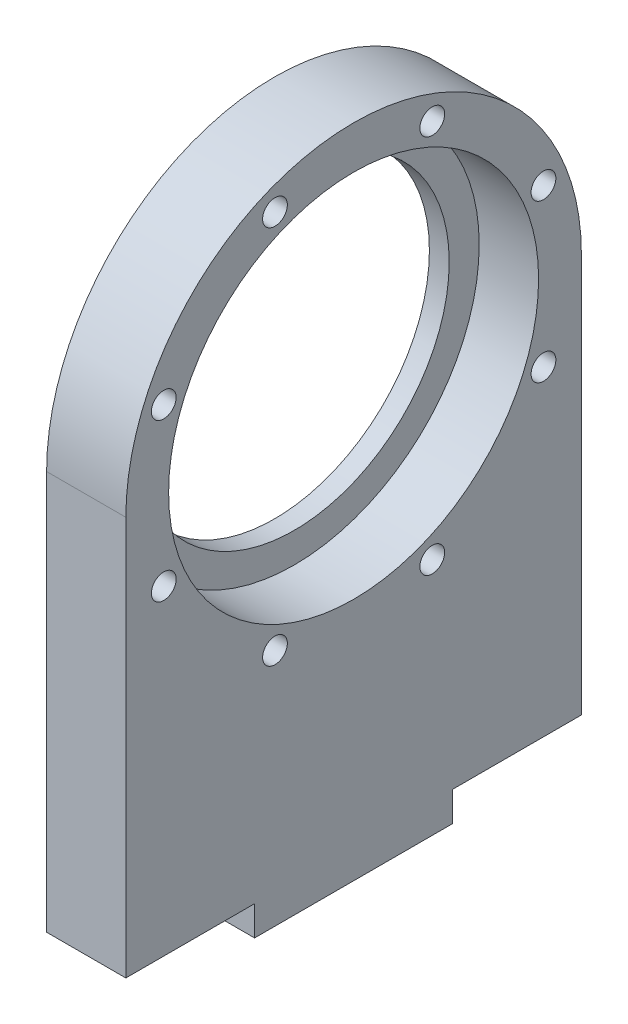
ISO-10303-21;
HEADER;
FILE_DESCRIPTION(('STEP AP214'),'2;1');
FILE_NAME('part.step','',(''),(''),'','','');
FILE_SCHEMA(('AUTOMOTIVE_DESIGN { 1 0 10303 214 1 1 1 1 }'));
ENDSEC;
DATA;
#1=APPLICATION_CONTEXT('core data for automotive mechanical design processes');
#2=APPLICATION_PROTOCOL_DEFINITION('international standard','automotive_design',2000,#1);
#3=PRODUCT_CONTEXT('',#1,'mechanical');
#4=PRODUCT('Part','Part','',(#3));
#5=PRODUCT_RELATED_PRODUCT_CATEGORY('part','',(#4));
#6=PRODUCT_DEFINITION_FORMATION('','',#4);
#7=PRODUCT_DEFINITION_CONTEXT('part definition',#1,'design');
#8=PRODUCT_DEFINITION('design','',#6,#7);
#9=PRODUCT_DEFINITION_SHAPE('','',#8);
#10=(LENGTH_UNIT() NAMED_UNIT(*) SI_UNIT(.MILLI.,.METRE.));
#11=(NAMED_UNIT(*) PLANE_ANGLE_UNIT() SI_UNIT($,.RADIAN.));
#12=(NAMED_UNIT(*) SI_UNIT($,.STERADIAN.) SOLID_ANGLE_UNIT());
#13=UNCERTAINTY_MEASURE_WITH_UNIT(LENGTH_MEASURE(1.E-05),#10,'distance_accuracy_value','');
#14=(GEOMETRIC_REPRESENTATION_CONTEXT(3) GLOBAL_UNCERTAINTY_ASSIGNED_CONTEXT((#13)) GLOBAL_UNIT_ASSIGNED_CONTEXT((#10,
#11,#12)) REPRESENTATION_CONTEXT('',''));
#15=CARTESIAN_POINT('',(0.,0.,0.));
#16=DIRECTION('',(0.,0.,1.));
#17=DIRECTION('',(1.,0.,0.));
#18=AXIS2_PLACEMENT_3D('',#15,#16,#17);
#19=CARTESIAN_POINT('',(8.,-40.29,-23.));
#20=DIRECTION('',(0.,-1.,0.));
#21=DIRECTION('',(0.,0.,-1.));
#22=AXIS2_PLACEMENT_3D('',#19,#20,#21);
#23=PLANE('',#22);
#24=DIRECTION('',(1.,0.,0.));
#25=VECTOR('',#24,1.);
#26=CARTESIAN_POINT('',(0.,-40.29,-9.99999999999999));
#27=LINE('',#26,#25);
#28=CARTESIAN_POINT('',(0.,-40.29,-9.99999999999999));
#29=VERTEX_POINT('',#28);
#30=CARTESIAN_POINT('',(8.,-40.29,-9.99999999999999));
#31=VERTEX_POINT('',#30);
#32=EDGE_CURVE('E130',#29,#31,#27,.T.);
#33=ORIENTED_EDGE('',*,*,#32,.F.);
#34=DIRECTION('',(0.,0.,1.));
#35=VECTOR('',#34,1.);
#36=CARTESIAN_POINT('',(0.,-40.29,-23.));
#37=LINE('',#36,#35);
#38=CARTESIAN_POINT('',(0.,-40.29,-23.));
#39=VERTEX_POINT('',#38);
#40=EDGE_CURVE('E165',#39,#29,#37,.T.);
#41=ORIENTED_EDGE('',*,*,#40,.F.);
#42=DIRECTION('',(-1.,0.,0.));
#43=VECTOR('',#42,1.);
#44=CARTESIAN_POINT('',(8.,-40.29,-23.));
#45=LINE('',#44,#43);
#46=CARTESIAN_POINT('',(8.,-40.29,-23.));
#47=VERTEX_POINT('',#46);
#48=EDGE_CURVE('E176',#47,#39,#45,.T.);
#49=ORIENTED_EDGE('',*,*,#48,.F.);
#50=DIRECTION('',(0.,0.,1.));
#51=VECTOR('',#50,1.);
#52=CARTESIAN_POINT('',(8.,-40.29,-23.));
#53=LINE('',#52,#51);
#54=EDGE_CURVE('E69',#47,#31,#53,.T.);
#55=ORIENTED_EDGE('',*,*,#54,.T.);
#56=EDGE_LOOP('',(#33,#41,#49,#55));
#57=FACE_BOUND('',#56,.T.);
#58=CARTESIAN_POINT('',(4.,-40.29,-19.));
#59=DIRECTION('',(0.,1.,0.));
#60=DIRECTION('',(0.,0.,1.));
#61=AXIS2_PLACEMENT_3D('',#58,#59,#60);
#62=CIRCLE('',#61,1.8);
#63=CARTESIAN_POINT('',(4.,-40.29,-17.2));
#64=VERTEX_POINT('',#63);
#65=EDGE_CURVE('E136',#64,#64,#62,.T.);
#66=ORIENTED_EDGE('',*,*,#65,.T.);
#67=EDGE_LOOP('',(#66));
#68=FACE_BOUND('',#67,.T.);
#69=ADVANCED_FACE('F46',(#57,#68),#23,.T.);
#70=CARTESIAN_POINT('',(8.,0.,0.));
#71=DIRECTION('',(-1.,0.,0.));
#72=DIRECTION('',(0.,0.,1.));
#73=AXIS2_PLACEMENT_3D('',#70,#71,#72);
#74=CYLINDRICAL_SURFACE('',#73,23.);
#75=DIRECTION('',(-1.,0.,0.));
#76=VECTOR('',#75,1.);
#77=CARTESIAN_POINT('',(8.,0.,23.));
#78=LINE('',#77,#76);
#79=CARTESIAN_POINT('',(8.,0.,23.));
#80=VERTEX_POINT('',#79);
#81=CARTESIAN_POINT('',(0.,0.,23.));
#82=VERTEX_POINT('',#81);
#83=EDGE_CURVE('E170',#80,#82,#78,.T.);
#84=ORIENTED_EDGE('',*,*,#83,.F.);
#85=CARTESIAN_POINT('',(8.,0.,0.));
#86=DIRECTION('',(1.,0.,0.));
#87=DIRECTION('',(0.,0.,-1.));
#88=AXIS2_PLACEMENT_3D('',#85,#86,#87);
#89=CIRCLE('',#88,23.);
#90=CARTESIAN_POINT('',(8.,0.,-23.));
#91=VERTEX_POINT('',#90);
#92=EDGE_CURVE('E208',#91,#80,#89,.T.);
#93=ORIENTED_EDGE('',*,*,#92,.F.);
#94=DIRECTION('',(-1.,0.,0.));
#95=VECTOR('',#94,1.);
#96=CARTESIAN_POINT('',(8.,0.,-23.));
#97=LINE('',#96,#95);
#98=CARTESIAN_POINT('',(0.,0.,-23.));
#99=VERTEX_POINT('',#98);
#100=EDGE_CURVE('E161',#91,#99,#97,.T.);
#101=ORIENTED_EDGE('',*,*,#100,.T.);
#102=CARTESIAN_POINT('',(0.,0.,0.));
#103=DIRECTION('',(1.,0.,0.));
#104=DIRECTION('',(0.,0.,-1.));
#105=AXIS2_PLACEMENT_3D('',#102,#103,#104);
#106=CIRCLE('',#105,23.);
#107=EDGE_CURVE('E184',#99,#82,#106,.T.);
#108=ORIENTED_EDGE('',*,*,#107,.T.);
#109=EDGE_LOOP('',(#84,#93,#101,#108));
#110=FACE_BOUND('',#109,.T.);
#111=ADVANCED_FACE('F247',(#110),#74,.T.);
#112=CARTESIAN_POINT('',(2.,0.,0.));
#113=DIRECTION('',(-1.,0.,0.));
#114=DIRECTION('',(0.,0.,1.));
#115=AXIS2_PLACEMENT_3D('',#112,#113,#114);
#116=CYLINDRICAL_SURFACE('',#115,15.6521739130435);
#117=CARTESIAN_POINT('',(2.,0.,0.));
#118=DIRECTION('',(1.,0.,0.));
#119=DIRECTION('',(0.,0.,-1.));
#120=AXIS2_PLACEMENT_3D('',#117,#118,#119);
#121=CIRCLE('',#120,15.6521739130435);
#122=CARTESIAN_POINT('',(2.,0.,-15.6521739130435));
#123=VERTEX_POINT('',#122);
#124=EDGE_CURVE('E11',#123,#123,#121,.T.);
#125=ORIENTED_EDGE('',*,*,#124,.T.);
#126=EDGE_LOOP('',(#125));
#127=FACE_BOUND('',#126,.T.);
#128=CARTESIAN_POINT('',(0.,0.,0.));
#129=DIRECTION('',(1.,0.,0.));
#130=DIRECTION('',(0.,0.,-1.));
#131=AXIS2_PLACEMENT_3D('',#128,#129,#130);
#132=CIRCLE('',#131,15.6521739130435);
#133=CARTESIAN_POINT('',(0.,0.,-15.6521739130435));
#134=VERTEX_POINT('',#133);
#135=EDGE_CURVE('E50',#134,#134,#132,.T.);
#136=ORIENTED_EDGE('',*,*,#135,.F.);
#137=EDGE_LOOP('',(#136));
#138=FACE_BOUND('',#137,.T.);
#139=ADVANCED_FACE('F48',(#127,#138),#116,.F.);
#140=CARTESIAN_POINT('',(2.,0.,0.));
#141=DIRECTION('',(1.,0.,0.));
#142=DIRECTION('',(0.,0.,-1.));
#143=AXIS2_PLACEMENT_3D('',#140,#141,#142);
#144=PLANE('',#143);
#145=ORIENTED_EDGE('',*,*,#124,.F.);
#146=EDGE_LOOP('',(#145));
#147=FACE_BOUND('',#146,.T.);
#148=CARTESIAN_POINT('',(2.,0.,0.));
#149=DIRECTION('',(1.,0.,0.));
#150=DIRECTION('',(0.,0.,-1.));
#151=AXIS2_PLACEMENT_3D('',#148,#149,#150);
#152=CIRCLE('',#151,18.68);
#153=CARTESIAN_POINT('',(2.,0.,-18.68));
#154=VERTEX_POINT('',#153);
#155=EDGE_CURVE('E210',#154,#154,#152,.F.);
#156=ORIENTED_EDGE('',*,*,#155,.F.);
#157=EDGE_LOOP('',(#156));
#158=FACE_BOUND('',#157,.T.);
#159=ADVANCED_FACE('F246',(#147,#158),#144,.T.);
#160=CARTESIAN_POINT('',(0.,0.,0.));
#161=DIRECTION('',(1.,0.,0.));
#162=DIRECTION('',(0.,0.,-1.));
#163=AXIS2_PLACEMENT_3D('',#160,#161,#162);
#164=PLANE('',#163);
#165=ORIENTED_EDGE('',*,*,#135,.T.);
#166=EDGE_LOOP('',(#165));
#167=FACE_BOUND('',#166,.T.);
#168=CARTESIAN_POINT('',(0.,19.1705002996092,7.9406812215757));
#169=DIRECTION('',(1.,0.,0.));
#170=DIRECTION('',(0.,0.,-1.));
#171=AXIS2_PLACEMENT_3D('',#168,#169,#170);
#172=CIRCLE('',#171,1.25);
#173=CARTESIAN_POINT('',(0.,19.1705002996092,6.6906812215757));
#174=VERTEX_POINT('',#173);
#175=EDGE_CURVE('E172',#174,#174,#172,.T.);
#176=ORIENTED_EDGE('',*,*,#175,.T.);
#177=EDGE_LOOP('',(#176));
#178=FACE_BOUND('',#177,.T.);
#179=CARTESIAN_POINT('',(0.,7.94068122157552,19.1705002996092));
#180=DIRECTION('',(1.,0.,0.));
#181=DIRECTION('',(0.,0.,-1.));
#182=AXIS2_PLACEMENT_3D('',#179,#180,#181);
#183=CIRCLE('',#182,1.25);
#184=CARTESIAN_POINT('',(0.,7.94068122157552,17.9205002996092));
#185=VERTEX_POINT('',#184);
#186=EDGE_CURVE('E213',#185,#185,#183,.T.);
#187=ORIENTED_EDGE('',*,*,#186,.T.);
#188=EDGE_LOOP('',(#187));
#189=FACE_BOUND('',#188,.T.);
#190=CARTESIAN_POINT('',(0.,-7.94068122157571,19.1705002996092));
#191=DIRECTION('',(1.,0.,0.));
#192=DIRECTION('',(0.,0.,-1.));
#193=AXIS2_PLACEMENT_3D('',#190,#191,#192);
#194=CIRCLE('',#193,1.25);
#195=CARTESIAN_POINT('',(0.,-7.94068122157571,17.9205002996092));
#196=VERTEX_POINT('',#195);
#197=EDGE_CURVE('E216',#196,#196,#194,.T.);
#198=ORIENTED_EDGE('',*,*,#197,.T.);
#199=EDGE_LOOP('',(#198));
#200=FACE_BOUND('',#199,.T.);
#201=CARTESIAN_POINT('',(0.,-19.1705002996092,7.94068122157552));
#202=DIRECTION('',(1.,0.,0.));
#203=DIRECTION('',(0.,0.,-1.));
#204=AXIS2_PLACEMENT_3D('',#201,#202,#203);
#205=CIRCLE('',#204,1.25);
#206=CARTESIAN_POINT('',(0.,-19.1705002996092,6.69068122157552));
#207=VERTEX_POINT('',#206);
#208=EDGE_CURVE('E219',#207,#207,#205,.T.);
#209=ORIENTED_EDGE('',*,*,#208,.T.);
#210=EDGE_LOOP('',(#209));
#211=FACE_BOUND('',#210,.T.);
#212=CARTESIAN_POINT('',(0.,-19.1705002996092,-7.94068122157571));
#213=DIRECTION('',(1.,0.,0.));
#214=DIRECTION('',(0.,0.,-1.));
#215=AXIS2_PLACEMENT_3D('',#212,#213,#214);
#216=CIRCLE('',#215,1.25);
#217=CARTESIAN_POINT('',(0.,-19.1705002996092,-9.1906812215757));
#218=VERTEX_POINT('',#217);
#219=EDGE_CURVE('E222',#218,#218,#216,.T.);
#220=ORIENTED_EDGE('',*,*,#219,.T.);
#221=EDGE_LOOP('',(#220));
#222=FACE_BOUND('',#221,.T.);
#223=CARTESIAN_POINT('',(0.,-7.94068122157552,-19.1705002996092));
#224=DIRECTION('',(1.,0.,0.));
#225=DIRECTION('',(0.,0.,-1.));
#226=AXIS2_PLACEMENT_3D('',#223,#224,#225);
#227=CIRCLE('',#226,1.25);
#228=CARTESIAN_POINT('',(0.,-7.94068122157552,-20.4205002996092));
#229=VERTEX_POINT('',#228);
#230=EDGE_CURVE('E225',#229,#229,#227,.T.);
#231=ORIENTED_EDGE('',*,*,#230,.T.);
#232=EDGE_LOOP('',(#231));
#233=FACE_BOUND('',#232,.T.);
#234=CARTESIAN_POINT('',(0.,7.94068122157571,-19.1705002996092));
#235=DIRECTION('',(1.,0.,0.));
#236=DIRECTION('',(0.,0.,-1.));
#237=AXIS2_PLACEMENT_3D('',#234,#235,#236);
#238=CIRCLE('',#237,1.25);
#239=CARTESIAN_POINT('',(0.,7.94068122157571,-20.4205002996092));
#240=VERTEX_POINT('',#239);
#241=EDGE_CURVE('E228',#240,#240,#238,.T.);
#242=ORIENTED_EDGE('',*,*,#241,.T.);
#243=EDGE_LOOP('',(#242));
#244=FACE_BOUND('',#243,.T.);
#245=CARTESIAN_POINT('',(0.,19.1705002996092,-7.94068122157552));
#246=DIRECTION('',(1.,0.,0.));
#247=DIRECTION('',(0.,0.,-1.));
#248=AXIS2_PLACEMENT_3D('',#245,#246,#247);
#249=CIRCLE('',#248,1.25);
#250=CARTESIAN_POINT('',(0.,19.1705002996092,-9.19068122157552));
#251=VERTEX_POINT('',#250);
#252=EDGE_CURVE('E231',#251,#251,#249,.T.);
#253=ORIENTED_EDGE('',*,*,#252,.T.);
#254=EDGE_LOOP('',(#253));
#255=FACE_BOUND('',#254,.T.);
#256=ORIENTED_EDGE('',*,*,#107,.F.);
#257=DIRECTION('',(0.,-1.,0.));
#258=VECTOR('',#257,1.);
#259=CARTESIAN_POINT('',(0.,-40.29,-23.));
#260=LINE('',#259,#258);
#261=EDGE_CURVE('E151',#99,#39,#260,.T.);
#262=ORIENTED_EDGE('',*,*,#261,.T.);
#263=ORIENTED_EDGE('',*,*,#40,.T.);
#264=DIRECTION('',(0.,1.,0.));
#265=VECTOR('',#264,1.);
#266=CARTESIAN_POINT('',(0.,-43.29,-9.99999999999999));
#267=LINE('',#266,#265);
#268=CARTESIAN_POINT('',(0.,-43.29,-9.99999999999999));
#269=VERTEX_POINT('',#268);
#270=EDGE_CURVE('E141',#269,#29,#267,.T.);
#271=ORIENTED_EDGE('',*,*,#270,.F.);
#272=DIRECTION('',(0.,0.,-1.));
#273=VECTOR('',#272,1.);
#274=CARTESIAN_POINT('',(0.,-43.29,10.));
#275=LINE('',#274,#273);
#276=CARTESIAN_POINT('',(0.,-43.29,10.));
#277=VERTEX_POINT('',#276);
#278=EDGE_CURVE('E120',#277,#269,#275,.T.);
#279=ORIENTED_EDGE('',*,*,#278,.F.);
#280=DIRECTION('',(0.,1.,0.));
#281=VECTOR('',#280,1.);
#282=CARTESIAN_POINT('',(0.,-43.29,10.));
#283=LINE('',#282,#281);
#284=CARTESIAN_POINT('',(0.,-40.29,10.));
#285=VERTEX_POINT('',#284);
#286=EDGE_CURVE('E117',#277,#285,#283,.T.);
#287=ORIENTED_EDGE('',*,*,#286,.T.);
#288=CARTESIAN_POINT('',(0.,-40.29,23.));
#289=VERTEX_POINT('',#288);
#290=EDGE_CURVE('E164',#285,#289,#37,.T.);
#291=ORIENTED_EDGE('',*,*,#290,.T.);
#292=DIRECTION('',(0.,1.,0.));
#293=VECTOR('',#292,1.);
#294=CARTESIAN_POINT('',(0.,-40.29,23.));
#295=LINE('',#294,#293);
#296=EDGE_CURVE('E157',#289,#82,#295,.T.);
#297=ORIENTED_EDGE('',*,*,#296,.T.);
#298=EDGE_LOOP('',(#256,#262,#263,#271,#279,#287,#291,#297));
#299=FACE_BOUND('',#298,.T.);
#300=ADVANCED_FACE('F242',(#167,#178,#189,#200,#211,#222,#233,#244,#255,#299),#164,.F.);
#301=CARTESIAN_POINT('',(8.,0.,0.));
#302=DIRECTION('',(-1.,0.,0.));
#303=DIRECTION('',(0.,0.,1.));
#304=AXIS2_PLACEMENT_3D('',#301,#302,#303);
#305=CYLINDRICAL_SURFACE('',#304,18.68);
#306=ORIENTED_EDGE('',*,*,#155,.T.);
#307=EDGE_LOOP('',(#306));
#308=FACE_BOUND('',#307,.T.);
#309=CARTESIAN_POINT('',(8.,0.,0.));
#310=DIRECTION('',(1.,0.,0.));
#311=DIRECTION('',(0.,0.,-1.));
#312=AXIS2_PLACEMENT_3D('',#309,#310,#311);
#313=CIRCLE('',#312,18.68);
#314=CARTESIAN_POINT('',(8.,0.,-18.68));
#315=VERTEX_POINT('',#314);
#316=EDGE_CURVE('E205',#315,#315,#313,.T.);
#317=ORIENTED_EDGE('',*,*,#316,.T.);
#318=EDGE_LOOP('',(#317));
#319=FACE_BOUND('',#318,.T.);
#320=ADVANCED_FACE('F444',(#308,#319),#305,.F.);
#321=CARTESIAN_POINT('',(8.,19.1705002996092,-7.94068122157552));
#322=DIRECTION('',(-1.,0.,0.));
#323=DIRECTION('',(0.,0.,1.));
#324=AXIS2_PLACEMENT_3D('',#321,#322,#323);
#325=CYLINDRICAL_SURFACE('',#324,1.25);
#326=CARTESIAN_POINT('',(8.,19.1705002996092,-7.94068122157552));
#327=DIRECTION('',(1.,0.,0.));
#328=DIRECTION('',(0.,0.,-1.));
#329=AXIS2_PLACEMENT_3D('',#326,#327,#328);
#330=CIRCLE('',#329,1.25);
#331=CARTESIAN_POINT('',(8.,19.1705002996092,-9.19068122157552));
#332=VERTEX_POINT('',#331);
#333=EDGE_CURVE('E202',#332,#332,#330,.T.);
#334=ORIENTED_EDGE('',*,*,#333,.T.);
#335=EDGE_LOOP('',(#334));
#336=FACE_BOUND('',#335,.T.);
#337=ORIENTED_EDGE('',*,*,#252,.F.);
#338=EDGE_LOOP('',(#337));
#339=FACE_BOUND('',#338,.T.);
#340=ADVANCED_FACE('F433',(#336,#339),#325,.F.);
#341=CARTESIAN_POINT('',(8.,7.94068122157571,-19.1705002996092));
#342=DIRECTION('',(-1.,0.,0.));
#343=DIRECTION('',(0.,0.,1.));
#344=AXIS2_PLACEMENT_3D('',#341,#342,#343);
#345=CYLINDRICAL_SURFACE('',#344,1.25);
#346=CARTESIAN_POINT('',(8.,7.94068122157571,-19.1705002996092));
#347=DIRECTION('',(1.,0.,0.));
#348=DIRECTION('',(0.,0.,-1.));
#349=AXIS2_PLACEMENT_3D('',#346,#347,#348);
#350=CIRCLE('',#349,1.25);
#351=CARTESIAN_POINT('',(8.,7.94068122157571,-20.4205002996092));
#352=VERTEX_POINT('',#351);
#353=EDGE_CURVE('E199',#352,#352,#350,.T.);
#354=ORIENTED_EDGE('',*,*,#353,.T.);
#355=EDGE_LOOP('',(#354));
#356=FACE_BOUND('',#355,.T.);
#357=ORIENTED_EDGE('',*,*,#241,.F.);
#358=EDGE_LOOP('',(#357));
#359=FACE_BOUND('',#358,.T.);
#360=ADVANCED_FACE('F422',(#356,#359),#345,.F.);
#361=CARTESIAN_POINT('',(8.,-7.94068122157552,-19.1705002996092));
#362=DIRECTION('',(-1.,0.,0.));
#363=DIRECTION('',(0.,0.,1.));
#364=AXIS2_PLACEMENT_3D('',#361,#362,#363);
#365=CYLINDRICAL_SURFACE('',#364,1.25);
#366=CARTESIAN_POINT('',(8.,-7.94068122157552,-19.1705002996092));
#367=DIRECTION('',(1.,0.,0.));
#368=DIRECTION('',(0.,0.,-1.));
#369=AXIS2_PLACEMENT_3D('',#366,#367,#368);
#370=CIRCLE('',#369,1.25);
#371=CARTESIAN_POINT('',(8.,-7.94068122157552,-20.4205002996092));
#372=VERTEX_POINT('',#371);
#373=EDGE_CURVE('E196',#372,#372,#370,.T.);
#374=ORIENTED_EDGE('',*,*,#373,.T.);
#375=EDGE_LOOP('',(#374));
#376=FACE_BOUND('',#375,.T.);
#377=ORIENTED_EDGE('',*,*,#230,.F.);
#378=EDGE_LOOP('',(#377));
#379=FACE_BOUND('',#378,.T.);
#380=ADVANCED_FACE('F411',(#376,#379),#365,.F.);
#381=CARTESIAN_POINT('',(8.,-19.1705002996092,-7.94068122157571));
#382=DIRECTION('',(-1.,0.,0.));
#383=DIRECTION('',(0.,0.,1.));
#384=AXIS2_PLACEMENT_3D('',#381,#382,#383);
#385=CYLINDRICAL_SURFACE('',#384,1.25);
#386=CARTESIAN_POINT('',(8.,-19.1705002996092,-7.94068122157571));
#387=DIRECTION('',(1.,0.,0.));
#388=DIRECTION('',(0.,0.,-1.));
#389=AXIS2_PLACEMENT_3D('',#386,#387,#388);
#390=CIRCLE('',#389,1.25);
#391=CARTESIAN_POINT('',(8.,-19.1705002996092,-9.1906812215757));
#392=VERTEX_POINT('',#391);
#393=EDGE_CURVE('E193',#392,#392,#390,.T.);
#394=ORIENTED_EDGE('',*,*,#393,.T.);
#395=EDGE_LOOP('',(#394));
#396=FACE_BOUND('',#395,.T.);
#397=ORIENTED_EDGE('',*,*,#219,.F.);
#398=EDGE_LOOP('',(#397));
#399=FACE_BOUND('',#398,.T.);
#400=ADVANCED_FACE('F400',(#396,#399),#385,.F.);
#401=CARTESIAN_POINT('',(8.,-19.1705002996092,7.94068122157552));
#402=DIRECTION('',(-1.,0.,0.));
#403=DIRECTION('',(0.,0.,1.));
#404=AXIS2_PLACEMENT_3D('',#401,#402,#403);
#405=CYLINDRICAL_SURFACE('',#404,1.25);
#406=CARTESIAN_POINT('',(8.,-19.1705002996092,7.94068122157552));
#407=DIRECTION('',(1.,0.,0.));
#408=DIRECTION('',(0.,0.,-1.));
#409=AXIS2_PLACEMENT_3D('',#406,#407,#408);
#410=CIRCLE('',#409,1.25);
#411=CARTESIAN_POINT('',(8.,-19.1705002996092,6.69068122157552));
#412=VERTEX_POINT('',#411);
#413=EDGE_CURVE('E190',#412,#412,#410,.T.);
#414=ORIENTED_EDGE('',*,*,#413,.T.);
#415=EDGE_LOOP('',(#414));
#416=FACE_BOUND('',#415,.T.);
#417=ORIENTED_EDGE('',*,*,#208,.F.);
#418=EDGE_LOOP('',(#417));
#419=FACE_BOUND('',#418,.T.);
#420=ADVANCED_FACE('F389',(#416,#419),#405,.F.);
#421=CARTESIAN_POINT('',(8.,-7.94068122157571,19.1705002996092));
#422=DIRECTION('',(-1.,0.,0.));
#423=DIRECTION('',(0.,0.,1.));
#424=AXIS2_PLACEMENT_3D('',#421,#422,#423);
#425=CYLINDRICAL_SURFACE('',#424,1.25);
#426=CARTESIAN_POINT('',(8.,-7.94068122157571,19.1705002996092));
#427=DIRECTION('',(1.,0.,0.));
#428=DIRECTION('',(0.,0.,-1.));
#429=AXIS2_PLACEMENT_3D('',#426,#427,#428);
#430=CIRCLE('',#429,1.25);
#431=CARTESIAN_POINT('',(8.,-7.94068122157571,17.9205002996092));
#432=VERTEX_POINT('',#431);
#433=EDGE_CURVE('E187',#432,#432,#430,.T.);
#434=ORIENTED_EDGE('',*,*,#433,.T.);
#435=EDGE_LOOP('',(#434));
#436=FACE_BOUND('',#435,.T.);
#437=ORIENTED_EDGE('',*,*,#197,.F.);
#438=EDGE_LOOP('',(#437));
#439=FACE_BOUND('',#438,.T.);
#440=ADVANCED_FACE('F378',(#436,#439),#425,.F.);
#441=CARTESIAN_POINT('',(8.,7.94068122157552,19.1705002996092));
#442=DIRECTION('',(-1.,0.,0.));
#443=DIRECTION('',(0.,0.,1.));
#444=AXIS2_PLACEMENT_3D('',#441,#442,#443);
#445=CYLINDRICAL_SURFACE('',#444,1.25);
#446=CARTESIAN_POINT('',(8.,7.94068122157552,19.1705002996092));
#447=DIRECTION('',(1.,0.,0.));
#448=DIRECTION('',(0.,0.,-1.));
#449=AXIS2_PLACEMENT_3D('',#446,#447,#448);
#450=CIRCLE('',#449,1.25);
#451=CARTESIAN_POINT('',(8.,7.94068122157552,17.9205002996092));
#452=VERTEX_POINT('',#451);
#453=EDGE_CURVE('E183',#452,#452,#450,.T.);
#454=ORIENTED_EDGE('',*,*,#453,.T.);
#455=EDGE_LOOP('',(#454));
#456=FACE_BOUND('',#455,.T.);
#457=ORIENTED_EDGE('',*,*,#186,.F.);
#458=EDGE_LOOP('',(#457));
#459=FACE_BOUND('',#458,.T.);
#460=ADVANCED_FACE('F366',(#456,#459),#445,.F.);
#461=CARTESIAN_POINT('',(8.,19.1705002996092,7.9406812215757));
#462=DIRECTION('',(-1.,0.,0.));
#463=DIRECTION('',(0.,0.,1.));
#464=AXIS2_PLACEMENT_3D('',#461,#462,#463);
#465=CYLINDRICAL_SURFACE('',#464,1.25);
#466=CARTESIAN_POINT('',(8.,19.1705002996092,7.9406812215757));
#467=DIRECTION('',(1.,0.,0.));
#468=DIRECTION('',(0.,0.,-1.));
#469=AXIS2_PLACEMENT_3D('',#466,#467,#468);
#470=CIRCLE('',#469,1.25);
#471=CARTESIAN_POINT('',(8.,19.1705002996092,6.6906812215757));
#472=VERTEX_POINT('',#471);
#473=EDGE_CURVE('E180',#472,#472,#470,.T.);
#474=ORIENTED_EDGE('',*,*,#473,.T.);
#475=EDGE_LOOP('',(#474));
#476=FACE_BOUND('',#475,.T.);
#477=ORIENTED_EDGE('',*,*,#175,.F.);
#478=EDGE_LOOP('',(#477));
#479=FACE_BOUND('',#478,.T.);
#480=ADVANCED_FACE('F361',(#476,#479),#465,.F.);
#481=CARTESIAN_POINT('',(8.,0.,0.));
#482=DIRECTION('',(1.,0.,0.));
#483=DIRECTION('',(0.,0.,-1.));
#484=AXIS2_PLACEMENT_3D('',#481,#482,#483);
#485=PLANE('',#484);
#486=ORIENTED_EDGE('',*,*,#473,.F.);
#487=EDGE_LOOP('',(#486));
#488=FACE_BOUND('',#487,.T.);
#489=ORIENTED_EDGE('',*,*,#453,.F.);
#490=EDGE_LOOP('',(#489));
#491=FACE_BOUND('',#490,.T.);
#492=ORIENTED_EDGE('',*,*,#433,.F.);
#493=EDGE_LOOP('',(#492));
#494=FACE_BOUND('',#493,.T.);
#495=ORIENTED_EDGE('',*,*,#413,.F.);
#496=EDGE_LOOP('',(#495));
#497=FACE_BOUND('',#496,.T.);
#498=ORIENTED_EDGE('',*,*,#393,.F.);
#499=EDGE_LOOP('',(#498));
#500=FACE_BOUND('',#499,.T.);
#501=ORIENTED_EDGE('',*,*,#373,.F.);
#502=EDGE_LOOP('',(#501));
#503=FACE_BOUND('',#502,.T.);
#504=ORIENTED_EDGE('',*,*,#353,.F.);
#505=EDGE_LOOP('',(#504));
#506=FACE_BOUND('',#505,.T.);
#507=ORIENTED_EDGE('',*,*,#333,.F.);
#508=EDGE_LOOP('',(#507));
#509=FACE_BOUND('',#508,.T.);
#510=ORIENTED_EDGE('',*,*,#316,.F.);
#511=EDGE_LOOP('',(#510));
#512=FACE_BOUND('',#511,.T.);
#513=ORIENTED_EDGE('',*,*,#92,.T.);
#514=DIRECTION('',(0.,1.,0.));
#515=VECTOR('',#514,1.);
#516=CARTESIAN_POINT('',(8.,-40.29,23.));
#517=LINE('',#516,#515);
#518=CARTESIAN_POINT('',(8.,-40.29,23.));
#519=VERTEX_POINT('',#518);
#520=EDGE_CURVE('E159',#519,#80,#517,.T.);
#521=ORIENTED_EDGE('',*,*,#520,.F.);
#522=CARTESIAN_POINT('',(8.,-40.29,10.));
#523=VERTEX_POINT('',#522);
#524=EDGE_CURVE('E135',#523,#519,#53,.T.);
#525=ORIENTED_EDGE('',*,*,#524,.F.);
#526=DIRECTION('',(0.,1.,0.));
#527=VECTOR('',#526,1.);
#528=CARTESIAN_POINT('',(8.,-43.29,10.));
#529=LINE('',#528,#527);
#530=CARTESIAN_POINT('',(8.,-43.29,10.));
#531=VERTEX_POINT('',#530);
#532=EDGE_CURVE('E115',#531,#523,#529,.T.);
#533=ORIENTED_EDGE('',*,*,#532,.F.);
#534=DIRECTION('',(0.,0.,1.));
#535=VECTOR('',#534,1.);
#536=CARTESIAN_POINT('',(8.,-43.29,10.));
#537=LINE('',#536,#535);
#538=CARTESIAN_POINT('',(8.,-43.29,-9.99999999999999));
#539=VERTEX_POINT('',#538);
#540=EDGE_CURVE('E121',#539,#531,#537,.T.);
#541=ORIENTED_EDGE('',*,*,#540,.F.);
#542=DIRECTION('',(0.,1.,0.));
#543=VECTOR('',#542,1.);
#544=CARTESIAN_POINT('',(8.,-43.29,-9.99999999999999));
#545=LINE('',#544,#543);
#546=EDGE_CURVE('E580',#539,#31,#545,.T.);
#547=ORIENTED_EDGE('',*,*,#546,.T.);
#548=ORIENTED_EDGE('',*,*,#54,.F.);
#549=DIRECTION('',(0.,-1.,0.));
#550=VECTOR('',#549,1.);
#551=CARTESIAN_POINT('',(8.,-40.29,-23.));
#552=LINE('',#551,#550);
#553=EDGE_CURVE('E154',#91,#47,#552,.T.);
#554=ORIENTED_EDGE('',*,*,#553,.F.);
#555=EDGE_LOOP('',(#513,#521,#525,#533,#541,#547,#548,#554));
#556=FACE_BOUND('',#555,.T.);
#557=ADVANCED_FACE('F133',(#488,#491,#494,#497,#500,#503,#506,#509,#512,#556),#485,.T.);
#558=CARTESIAN_POINT('',(8.,-40.29,23.));
#559=DIRECTION('',(0.,0.,1.));
#560=DIRECTION('',(1.,0.,0.));
#561=AXIS2_PLACEMENT_3D('',#558,#559,#560);
#562=PLANE('',#561);
#563=ORIENTED_EDGE('',*,*,#296,.F.);
#564=DIRECTION('',(-1.,0.,0.));
#565=VECTOR('',#564,1.);
#566=CARTESIAN_POINT('',(8.,-40.29,23.));
#567=LINE('',#566,#565);
#568=EDGE_CURVE('E173',#519,#289,#567,.T.);
#569=ORIENTED_EDGE('',*,*,#568,.F.);
#570=ORIENTED_EDGE('',*,*,#520,.T.);
#571=ORIENTED_EDGE('',*,*,#83,.T.);
#572=EDGE_LOOP('',(#563,#569,#570,#571));
#573=FACE_BOUND('',#572,.T.);
#574=ADVANCED_FACE('F267',(#573),#562,.T.);
#575=DIRECTION('',(-1.,0.,0.));
#576=VECTOR('',#575,1.);
#577=CARTESIAN_POINT('',(0.,-40.29,10.));
#578=LINE('',#577,#576);
#579=EDGE_CURVE('E61',#523,#285,#578,.T.);
#580=ORIENTED_EDGE('',*,*,#579,.F.);
#581=ORIENTED_EDGE('',*,*,#524,.T.);
#582=ORIENTED_EDGE('',*,*,#568,.T.);
#583=ORIENTED_EDGE('',*,*,#290,.F.);
#584=EDGE_LOOP('',(#580,#581,#582,#583));
#585=FACE_BOUND('',#584,.T.);
#586=CARTESIAN_POINT('',(4.,-40.29,19.));
#587=DIRECTION('',(0.,-1.,0.));
#588=DIRECTION('',(0.,0.,-1.));
#589=AXIS2_PLACEMENT_3D('',#586,#587,#588);
#590=CIRCLE('',#589,1.8);
#591=CARTESIAN_POINT('',(4.,-40.29,17.2));
#592=VERTEX_POINT('',#591);
#593=EDGE_CURVE('E146',#592,#592,#590,.T.);
#594=ORIENTED_EDGE('',*,*,#593,.F.);
#595=EDGE_LOOP('',(#594));
#596=FACE_BOUND('',#595,.T.);
#597=ADVANCED_FACE('F259',(#585,#596),#23,.T.);
#598=CARTESIAN_POINT('',(8.,-40.29,-23.));
#599=DIRECTION('',(0.,0.,-1.));
#600=DIRECTION('',(-1.,0.,0.));
#601=AXIS2_PLACEMENT_3D('',#598,#599,#600);
#602=PLANE('',#601);
#603=ORIENTED_EDGE('',*,*,#261,.F.);
#604=ORIENTED_EDGE('',*,*,#100,.F.);
#605=ORIENTED_EDGE('',*,*,#553,.T.);
#606=ORIENTED_EDGE('',*,*,#48,.T.);
#607=EDGE_LOOP('',(#603,#604,#605,#606));
#608=FACE_BOUND('',#607,.T.);
#609=ADVANCED_FACE('F266',(#608),#602,.T.);
#610=CARTESIAN_POINT('',(4.,-35.29,19.));
#611=DIRECTION('',(0.,-1.,0.));
#612=DIRECTION('',(0.,0.,-1.));
#613=AXIS2_PLACEMENT_3D('',#610,#611,#612);
#614=CYLINDRICAL_SURFACE('',#613,1.8);
#615=CARTESIAN_POINT('',(4.,-35.29,19.));
#616=DIRECTION('',(0.,-1.,0.));
#617=DIRECTION('',(0.,0.,-1.));
#618=AXIS2_PLACEMENT_3D('',#615,#616,#617);
#619=CIRCLE('',#618,1.8);
#620=CARTESIAN_POINT('',(4.,-35.29,17.2));
#621=VERTEX_POINT('',#620);
#622=EDGE_CURVE('E148',#621,#621,#619,.T.);
#623=ORIENTED_EDGE('',*,*,#622,.F.);
#624=EDGE_LOOP('',(#623));
#625=FACE_BOUND('',#624,.T.);
#626=ORIENTED_EDGE('',*,*,#593,.T.);
#627=EDGE_LOOP('',(#626));
#628=FACE_BOUND('',#627,.T.);
#629=ADVANCED_FACE('F272',(#625,#628),#614,.F.);
#630=CARTESIAN_POINT('',(4.,-35.29,19.));
#631=DIRECTION('',(0.,-1.,0.));
#632=DIRECTION('',(0.,0.,-1.));
#633=AXIS2_PLACEMENT_3D('',#630,#631,#632);
#634=PLANE('',#633);
#635=ORIENTED_EDGE('',*,*,#622,.T.);
#636=EDGE_LOOP('',(#635));
#637=FACE_BOUND('',#636,.T.);
#638=ADVANCED_FACE('F279',(#637),#634,.T.);
#639=CARTESIAN_POINT('',(4.,-35.29,-19.));
#640=DIRECTION('',(0.,-1.,0.));
#641=DIRECTION('',(0.,0.,-1.));
#642=AXIS2_PLACEMENT_3D('',#639,#640,#641);
#643=CYLINDRICAL_SURFACE('',#642,1.8);
#644=CARTESIAN_POINT('',(4.,-35.29,-19.));
#645=DIRECTION('',(0.,1.,0.));
#646=DIRECTION('',(0.,0.,1.));
#647=AXIS2_PLACEMENT_3D('',#644,#645,#646);
#648=CIRCLE('',#647,1.8);
#649=CARTESIAN_POINT('',(4.,-35.29,-17.2));
#650=VERTEX_POINT('',#649);
#651=EDGE_CURVE('E139',#650,#650,#648,.T.);
#652=ORIENTED_EDGE('',*,*,#651,.T.);
#653=EDGE_LOOP('',(#652));
#654=FACE_BOUND('',#653,.T.);
#655=ORIENTED_EDGE('',*,*,#65,.F.);
#656=EDGE_LOOP('',(#655));
#657=FACE_BOUND('',#656,.T.);
#658=ADVANCED_FACE('F285',(#654,#657),#643,.F.);
#659=CARTESIAN_POINT('',(4.,-35.29,-19.));
#660=DIRECTION('',(0.,-1.,0.));
#661=DIRECTION('',(0.,0.,1.));
#662=AXIS2_PLACEMENT_3D('',#659,#660,#661);
#663=PLANE('',#662);
#664=ORIENTED_EDGE('',*,*,#651,.F.);
#665=EDGE_LOOP('',(#664));
#666=FACE_BOUND('',#665,.T.);
#667=ADVANCED_FACE('F292',(#666),#663,.T.);
#668=CARTESIAN_POINT('',(0.,-43.29,10.));
#669=DIRECTION('',(0.,0.,-1.));
#670=DIRECTION('',(-1.,0.,0.));
#671=AXIS2_PLACEMENT_3D('',#668,#669,#670);
#672=PLANE('',#671);
#673=ORIENTED_EDGE('',*,*,#579,.T.);
#674=ORIENTED_EDGE('',*,*,#286,.F.);
#675=DIRECTION('',(-1.,0.,0.));
#676=VECTOR('',#675,1.);
#677=CARTESIAN_POINT('',(0.,-43.29,10.));
#678=LINE('',#677,#676);
#679=EDGE_CURVE('E111',#531,#277,#678,.T.);
#680=ORIENTED_EDGE('',*,*,#679,.F.);
#681=ORIENTED_EDGE('',*,*,#532,.T.);
#682=EDGE_LOOP('',(#673,#674,#680,#681));
#683=FACE_BOUND('',#682,.T.);
#684=ADVANCED_FACE('F113',(#683),#672,.F.);
#685=CARTESIAN_POINT('',(0.,-43.29,-9.99999999999999));
#686=DIRECTION('',(0.,0.,1.));
#687=DIRECTION('',(1.,0.,0.));
#688=AXIS2_PLACEMENT_3D('',#685,#686,#687);
#689=PLANE('',#688);
#690=ORIENTED_EDGE('',*,*,#32,.T.);
#691=ORIENTED_EDGE('',*,*,#546,.F.);
#692=DIRECTION('',(1.,0.,0.));
#693=VECTOR('',#692,1.);
#694=CARTESIAN_POINT('',(0.,-43.29,-9.99999999999999));
#695=LINE('',#694,#693);
#696=EDGE_CURVE('E126',#269,#539,#695,.T.);
#697=ORIENTED_EDGE('',*,*,#696,.F.);
#698=ORIENTED_EDGE('',*,*,#270,.T.);
#699=EDGE_LOOP('',(#690,#691,#697,#698));
#700=FACE_BOUND('',#699,.T.);
#701=ADVANCED_FACE('F299',(#700),#689,.F.);
#702=CARTESIAN_POINT('',(0.,-43.29,0.));
#703=DIRECTION('',(0.,-1.,0.));
#704=DIRECTION('',(0.,0.,-1.));
#705=AXIS2_PLACEMENT_3D('',#702,#703,#704);
#706=PLANE('',#705);
#707=ORIENTED_EDGE('',*,*,#540,.T.);
#708=ORIENTED_EDGE('',*,*,#679,.T.);
#709=ORIENTED_EDGE('',*,*,#278,.T.);
#710=ORIENTED_EDGE('',*,*,#696,.T.);
#711=EDGE_LOOP('',(#707,#708,#709,#710));
#712=FACE_BOUND('',#711,.T.);
#713=ADVANCED_FACE('F124',(#712),#706,.T.);
#714=CLOSED_SHELL('',(#69,#111,#139,#159,#300,#320,#340,#360,#380,#400,#420,#440,#460,#480,#557,
#574,#597,#609,#629,#638,#658,#667,#684,#701,#713));
#715=MANIFOLD_SOLID_BREP('B2',#714);
#716=ADVANCED_BREP_SHAPE_REPRESENTATION('',(#18,#715),#14);
#717=SHAPE_DEFINITION_REPRESENTATION(#9,#716);
ENDSEC;
END-ISO-10303-21;
